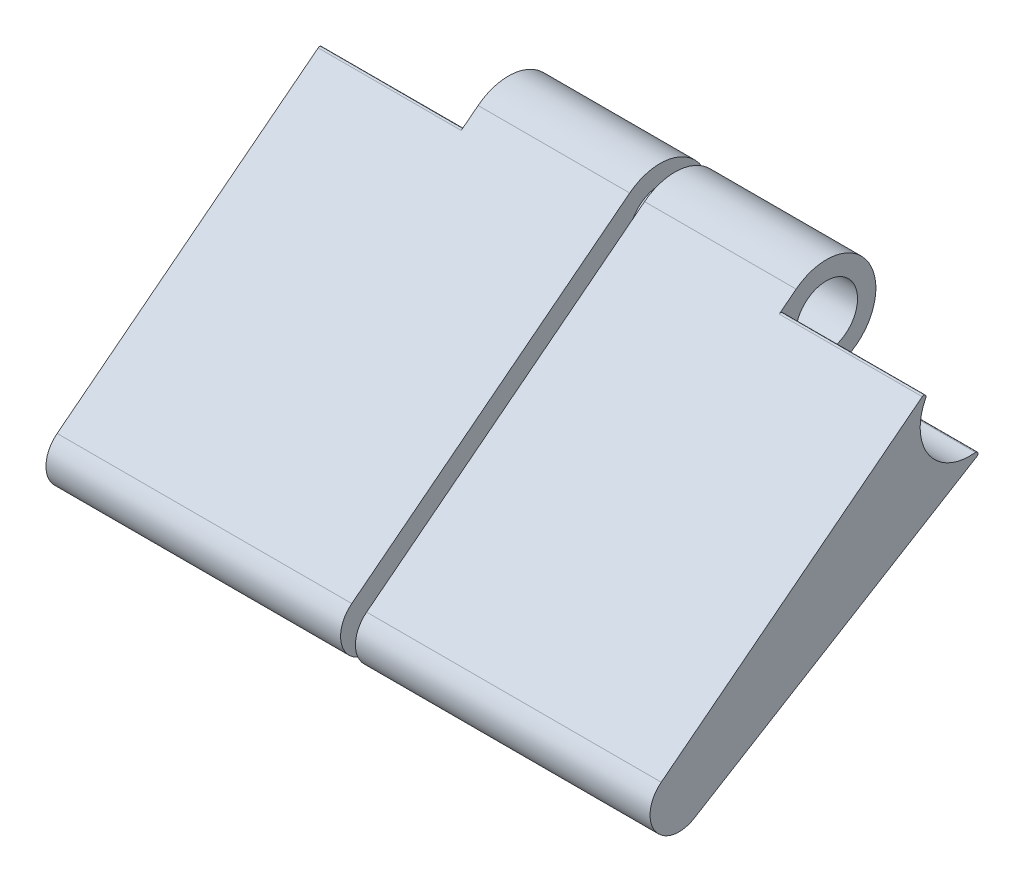
ISO-10303-21;
HEADER;
FILE_DESCRIPTION(('STEP AP214'),'2;1');
FILE_NAME('part.step','',(''),(''),'','','');
FILE_SCHEMA(('AUTOMOTIVE_DESIGN { 1 0 10303 214 1 1 1 1 }'));
ENDSEC;
DATA;
#1=APPLICATION_CONTEXT('core data for automotive mechanical design processes');
#2=APPLICATION_PROTOCOL_DEFINITION('international standard','automotive_design',2000,#1);
#3=PRODUCT_CONTEXT('',#1,'mechanical');
#4=PRODUCT('Part','Part','',(#3));
#5=PRODUCT_RELATED_PRODUCT_CATEGORY('part','',(#4));
#6=PRODUCT_DEFINITION_FORMATION('','',#4);
#7=PRODUCT_DEFINITION_CONTEXT('part definition',#1,'design');
#8=PRODUCT_DEFINITION('design','',#6,#7);
#9=PRODUCT_DEFINITION_SHAPE('','',#8);
#10=(LENGTH_UNIT() NAMED_UNIT(*) SI_UNIT(.MILLI.,.METRE.));
#11=(NAMED_UNIT(*) PLANE_ANGLE_UNIT() SI_UNIT($,.RADIAN.));
#12=(NAMED_UNIT(*) SI_UNIT($,.STERADIAN.) SOLID_ANGLE_UNIT());
#13=UNCERTAINTY_MEASURE_WITH_UNIT(LENGTH_MEASURE(1.E-05),#10,'distance_accuracy_value','');
#14=(GEOMETRIC_REPRESENTATION_CONTEXT(3) GLOBAL_UNCERTAINTY_ASSIGNED_CONTEXT((#13)) GLOBAL_UNIT_ASSIGNED_CONTEXT((#10,
#11,#12)) REPRESENTATION_CONTEXT('',''));
#15=CARTESIAN_POINT('',(0.,0.,0.));
#16=DIRECTION('',(0.,0.,1.));
#17=DIRECTION('',(1.,0.,0.));
#18=AXIS2_PLACEMENT_3D('',#15,#16,#17);
#19=CARTESIAN_POINT('',(44.25,0.,0.));
#20=DIRECTION('',(-1.,0.,0.));
#21=DIRECTION('',(0.,0.,-1.));
#22=AXIS2_PLACEMENT_3D('',#19,#20,#21);
#23=PLANE('',#22);
#24=CARTESIAN_POINT('',(44.25,-39.375,83.));
#25=DIRECTION('',(1.,0.,0.));
#26=DIRECTION('',(0.,0.,-1.));
#27=AXIS2_PLACEMENT_3D('',#24,#25,#26);
#28=CIRCLE('',#27,2.125);
#29=CARTESIAN_POINT('',(44.25,-38.3905832731811,84.883228267619));
#30=VERTEX_POINT('',#29);
#31=CARTESIAN_POINT('',(44.25,-41.4848766818374,82.7469280982826));
#32=VERTEX_POINT('',#31);
#33=EDGE_CURVE('E141',#30,#32,#28,.T.);
#34=ORIENTED_EDGE('',*,*,#33,.T.);
#35=CARTESIAN_POINT('',(44.25,-41.5841649962768,82.7350188323195));
#36=DIRECTION('',(1.,0.,0.));
#37=DIRECTION('',(0.,0.,-1.));
#38=AXIS2_PLACEMENT_3D('',#35,#36,#37);
#39=CIRCLE('',#38,0.0999999999999971);
#40=CARTESIAN_POINT('',(44.25,-41.6695937765194,82.68303880244));
#41=VERTEX_POINT('',#40);
#42=EDGE_CURVE('E191',#32,#41,#39,.F.);
#43=ORIENTED_EDGE('',*,*,#42,.T.);
#44=DIRECTION('',(0.,0.519800298794591,-0.854287802425537));
#45=VECTOR('',#44,1.);
#46=CARTESIAN_POINT('',(44.25,6.30536378724332,3.8365641781516));
#47=LINE('',#46,#45);
#48=CARTESIAN_POINT('',(44.25,-49.0728597530319,94.8502496265068));
#49=VERTEX_POINT('',#48);
#50=EDGE_CURVE('E158',#49,#41,#47,.T.);
#51=ORIENTED_EDGE('',*,*,#50,.F.);
#52=CARTESIAN_POINT('',(44.25,-48.005,95.5));
#53=DIRECTION('',(1.,0.,0.));
#54=DIRECTION('',(0.,0.,-1.));
#55=AXIS2_PLACEMENT_3D('',#52,#53,#54);
#56=CIRCLE('',#55,1.25);
#57=CARTESIAN_POINT('',(44.25,-47.0189604638566,96.2682616957535));
#58=VERTEX_POINT('',#57);
#59=EDGE_CURVE('E167',#58,#49,#56,.T.);
#60=ORIENTED_EDGE('',*,*,#59,.F.);
#61=DIRECTION('',(0.,0.614609356602763,-0.788831628914776));
#62=VECTOR('',#61,1.);
#63=CARTESIAN_POINT('',(44.25,17.4152971400888,13.568934330183));
#64=LINE('',#63,#62);
#65=CARTESIAN_POINT('',(44.25,-38.2653746172628,85.0333117099908));
#66=VERTEX_POINT('',#65);
#67=EDGE_CURVE('E52',#58,#66,#64,.T.);
#68=ORIENTED_EDGE('',*,*,#67,.T.);
#69=CARTESIAN_POINT('',(44.25,-38.3442577801543,84.9718507743305));
#70=DIRECTION('',(1.,0.,0.));
#71=DIRECTION('',(0.,0.,-1.));
#72=AXIS2_PLACEMENT_3D('',#69,#70,#71);
#73=CIRCLE('',#72,0.100000000000003);
#74=EDGE_CURVE('E129',#30,#66,#73,.T.);
#75=ORIENTED_EDGE('',*,*,#74,.F.);
#76=EDGE_LOOP('',(#34,#43,#51,#60,#68,#75));
#77=FACE_BOUND('',#76,.T.);
#78=ADVANCED_FACE('F48',(#77),#23,.T.);
#79=CARTESIAN_POINT('',(50.4062351896748,-39.375,83.));
#80=DIRECTION('',(-1.,0.,0.));
#81=DIRECTION('',(0.,0.,-1.));
#82=AXIS2_PLACEMENT_3D('',#79,#80,#81);
#83=CYLINDRICAL_SURFACE('',#82,2.125);
#84=DIRECTION('',(-1.,0.,0.));
#85=VECTOR('',#84,1.);
#86=CARTESIAN_POINT('',(50.4062351896748,-41.4848766818374,82.7469280982826));
#87=LINE('',#86,#85);
#88=CARTESIAN_POINT('',(50.4062351896748,-41.4848766818374,82.7469280982826));
#89=VERTEX_POINT('',#88);
#90=EDGE_CURVE('E183',#89,#32,#87,.T.);
#91=ORIENTED_EDGE('',*,*,#90,.T.);
#92=ORIENTED_EDGE('',*,*,#33,.F.);
#93=DIRECTION('',(-1.,0.,0.));
#94=VECTOR('',#93,1.);
#95=CARTESIAN_POINT('',(50.4062351896748,-38.3905832731811,84.883228267619));
#96=LINE('',#95,#94);
#97=CARTESIAN_POINT('',(50.4062351896748,-38.3905832731811,84.883228267619));
#98=VERTEX_POINT('',#97);
#99=EDGE_CURVE('E132',#98,#30,#96,.T.);
#100=ORIENTED_EDGE('',*,*,#99,.F.);
#101=CARTESIAN_POINT('',(50.4062351896748,-39.375,83.));
#102=DIRECTION('',(1.,0.,0.));
#103=DIRECTION('',(0.,0.,-1.));
#104=AXIS2_PLACEMENT_3D('',#101,#102,#103);
#105=CIRCLE('',#104,2.125);
#106=EDGE_CURVE('E121',#98,#89,#105,.T.);
#107=ORIENTED_EDGE('',*,*,#106,.T.);
#108=EDGE_LOOP('',(#91,#92,#100,#107));
#109=FACE_BOUND('',#108,.T.);
#110=ADVANCED_FACE('F186',(#109),#83,.F.);
#111=CARTESIAN_POINT('',(76.833645803728,-39.375,83.));
#112=DIRECTION('',(-1.,0.,0.));
#113=DIRECTION('',(0.,0.,-1.));
#114=AXIS2_PLACEMENT_3D('',#111,#112,#113);
#115=CYLINDRICAL_SURFACE('',#114,2.125);
#116=DIRECTION('',(-1.,0.,0.));
#117=VECTOR('',#116,1.);
#118=CARTESIAN_POINT('',(76.833645803728,-37.6987327885561,84.3060448827809));
#119=LINE('',#118,#117);
#120=CARTESIAN_POINT('',(56.9304890189363,-37.6987327885561,84.3060448827809));
#121=VERTEX_POINT('',#120);
#122=CARTESIAN_POINT('',(50.4062351896748,-37.6987327885561,84.3060448827809));
#123=VERTEX_POINT('',#122);
#124=EDGE_CURVE('E136',#121,#123,#119,.T.);
#125=ORIENTED_EDGE('',*,*,#124,.F.);
#126=CARTESIAN_POINT('',(56.9304890189363,-39.375,83.));
#127=DIRECTION('',(-1.,0.,0.));
#128=DIRECTION('',(0.,0.,1.));
#129=AXIS2_PLACEMENT_3D('',#126,#127,#128);
#130=CIRCLE('',#129,2.125);
#131=CARTESIAN_POINT('',(56.9304890189363,-41.1903615801543,81.8954243650615));
#132=VERTEX_POINT('',#131);
#133=EDGE_CURVE('E152',#132,#121,#130,.F.);
#134=ORIENTED_EDGE('',*,*,#133,.F.);
#135=DIRECTION('',(-1.,0.,0.));
#136=VECTOR('',#135,1.);
#137=CARTESIAN_POINT('',(76.833645803728,-41.1903615801543,81.8954243650615));
#138=LINE('',#137,#136);
#139=CARTESIAN_POINT('',(50.4062351896748,-41.1903615801543,81.8954243650615));
#140=VERTEX_POINT('',#139);
#141=EDGE_CURVE('E169',#132,#140,#138,.T.);
#142=ORIENTED_EDGE('',*,*,#141,.T.);
#143=EDGE_CURVE('E149',#140,#123,#105,.T.);
#144=ORIENTED_EDGE('',*,*,#143,.T.);
#145=EDGE_LOOP('',(#125,#134,#142,#144));
#146=FACE_BOUND('',#145,.T.);
#147=ADVANCED_FACE('F176',(#146),#115,.T.);
#148=CARTESIAN_POINT('',(76.833645803728,-39.375,83.));
#149=DIRECTION('',(-1.,0.,0.));
#150=DIRECTION('',(0.,0.,-1.));
#151=AXIS2_PLACEMENT_3D('',#148,#149,#150);
#152=CYLINDRICAL_SURFACE('',#151,1.33513379726097);
#153=CARTESIAN_POINT('',(56.9304890189363,-39.375,83.));
#154=DIRECTION('',(-1.,0.,0.));
#155=DIRECTION('',(0.,0.,1.));
#156=AXIS2_PLACEMENT_3D('',#153,#154,#155);
#157=CIRCLE('',#156,1.33513379726097);
#158=CARTESIAN_POINT('',(56.9304890189363,-39.375,84.335133797261));
#159=VERTEX_POINT('',#158);
#160=EDGE_CURVE('E148',#159,#159,#157,.T.);
#161=ORIENTED_EDGE('',*,*,#160,.F.);
#162=EDGE_LOOP('',(#161));
#163=FACE_BOUND('',#162,.T.);
#164=CARTESIAN_POINT('',(50.4062351896748,-39.375,83.));
#165=DIRECTION('',(1.,0.,0.));
#166=DIRECTION('',(0.,0.,-1.));
#167=AXIS2_PLACEMENT_3D('',#164,#165,#166);
#168=CIRCLE('',#167,1.33513379726097);
#169=CARTESIAN_POINT('',(50.4062351896748,-39.375,81.664866202739));
#170=VERTEX_POINT('',#169);
#171=EDGE_CURVE('E137',#170,#170,#168,.T.);
#172=ORIENTED_EDGE('',*,*,#171,.F.);
#173=EDGE_LOOP('',(#172));
#174=FACE_BOUND('',#173,.T.);
#175=ADVANCED_FACE('F217',(#163,#174),#152,.F.);
#176=CARTESIAN_POINT('',(76.833645803728,17.4152971400888,13.568934330183));
#177=DIRECTION('',(0.,-0.788831628914776,-0.614609356602763));
#178=DIRECTION('',(0.,0.614609356602763,-0.788831628914776));
#179=AXIS2_PLACEMENT_3D('',#176,#177,#178);
#180=PLANE('',#179);
#181=ORIENTED_EDGE('',*,*,#67,.F.);
#182=DIRECTION('',(-1.,0.,0.));
#183=VECTOR('',#182,1.);
#184=CARTESIAN_POINT('',(76.833645803728,-47.0189604638566,96.2682616957535));
#185=LINE('',#184,#183);
#186=CARTESIAN_POINT('',(56.9304890189363,-47.0189604638566,96.2682616957535));
#187=VERTEX_POINT('',#186);
#188=EDGE_CURVE('E58',#187,#58,#185,.T.);
#189=ORIENTED_EDGE('',*,*,#188,.F.);
#190=DIRECTION('',(0.,0.614609356602763,-0.788831628914776));
#191=VECTOR('',#190,1.);
#192=CARTESIAN_POINT('',(56.9304890189363,17.4152971400888,13.568934330183));
#193=LINE('',#192,#191);
#194=EDGE_CURVE('E74',#187,#121,#193,.T.);
#195=ORIENTED_EDGE('',*,*,#194,.T.);
#196=ORIENTED_EDGE('',*,*,#124,.T.);
#197=DIRECTION('',(0.,-0.614609356602763,0.788831628914776));
#198=VECTOR('',#197,1.);
#199=CARTESIAN_POINT('',(50.4062351896748,17.4152971400888,13.568934330183));
#200=LINE('',#199,#198);
#201=CARTESIAN_POINT('',(50.4062351896748,-38.2653746172628,85.0333117099908));
#202=VERTEX_POINT('',#201);
#203=EDGE_CURVE('E118',#123,#202,#200,.T.);
#204=ORIENTED_EDGE('',*,*,#203,.T.);
#205=DIRECTION('',(-1.,0.,0.));
#206=VECTOR('',#205,1.);
#207=CARTESIAN_POINT('',(50.4062351896748,-38.2653746172628,85.0333117099908));
#208=LINE('',#207,#206);
#209=EDGE_CURVE('E123',#202,#66,#208,.T.);
#210=ORIENTED_EDGE('',*,*,#209,.T.);
#211=EDGE_LOOP('',(#181,#189,#195,#196,#204,#210));
#212=FACE_BOUND('',#211,.T.);
#213=ADVANCED_FACE('F134',(#212),#180,.F.);
#214=CARTESIAN_POINT('',(76.833645803728,-48.005,95.5));
#215=DIRECTION('',(-1.,0.,0.));
#216=DIRECTION('',(0.,0.,-1.));
#217=AXIS2_PLACEMENT_3D('',#214,#215,#216);
#218=CYLINDRICAL_SURFACE('',#217,1.25);
#219=ORIENTED_EDGE('',*,*,#188,.T.);
#220=ORIENTED_EDGE('',*,*,#59,.T.);
#221=DIRECTION('',(-1.,0.,0.));
#222=VECTOR('',#221,1.);
#223=CARTESIAN_POINT('',(76.833645803728,-49.0728597530319,94.8502496265068));
#224=LINE('',#223,#222);
#225=CARTESIAN_POINT('',(56.9304890189363,-49.0728597530319,94.8502496265068));
#226=VERTEX_POINT('',#225);
#227=EDGE_CURVE('E12',#226,#49,#224,.T.);
#228=ORIENTED_EDGE('',*,*,#227,.F.);
#229=CARTESIAN_POINT('',(56.9304890189363,-48.005,95.5));
#230=DIRECTION('',(-1.,0.,0.));
#231=DIRECTION('',(0.,0.,1.));
#232=AXIS2_PLACEMENT_3D('',#229,#230,#231);
#233=CIRCLE('',#232,1.25);
#234=EDGE_CURVE('E210',#187,#226,#233,.F.);
#235=ORIENTED_EDGE('',*,*,#234,.F.);
#236=EDGE_LOOP('',(#219,#220,#228,#235));
#237=FACE_BOUND('',#236,.T.);
#238=ADVANCED_FACE('F208',(#237),#218,.T.);
#239=CARTESIAN_POINT('',(76.833645803728,6.30536378724332,3.8365641781516));
#240=DIRECTION('',(0.,-0.854287802425538,-0.519800298794591));
#241=DIRECTION('',(0.,0.519800298794591,-0.854287802425538));
#242=AXIS2_PLACEMENT_3D('',#239,#240,#241);
#243=PLANE('',#242);
#244=DIRECTION('',(-1.,0.,0.));
#245=VECTOR('',#244,1.);
#246=CARTESIAN_POINT('',(50.4062351896748,-41.6695937765194,82.68303880244));
#247=LINE('',#246,#245);
#248=CARTESIAN_POINT('',(50.4062351896748,-41.6695937765194,82.68303880244));
#249=VERTEX_POINT('',#248);
#250=EDGE_CURVE('E124',#249,#41,#247,.T.);
#251=ORIENTED_EDGE('',*,*,#250,.F.);
#252=DIRECTION('',(0.,-0.519800298794591,0.854287802425538));
#253=VECTOR('',#252,1.);
#254=CARTESIAN_POINT('',(50.4062351896748,6.30536378724332,3.8365641781516));
#255=LINE('',#254,#253);
#256=EDGE_CURVE('E138',#140,#249,#255,.T.);
#257=ORIENTED_EDGE('',*,*,#256,.F.);
#258=ORIENTED_EDGE('',*,*,#141,.F.);
#259=DIRECTION('',(0.,0.519800298794591,-0.854287802425538));
#260=VECTOR('',#259,1.);
#261=CARTESIAN_POINT('',(56.9304890189363,6.30536378724332,3.83656417815159));
#262=LINE('',#261,#260);
#263=EDGE_CURVE('E161',#226,#132,#262,.T.);
#264=ORIENTED_EDGE('',*,*,#263,.F.);
#265=ORIENTED_EDGE('',*,*,#227,.T.);
#266=ORIENTED_EDGE('',*,*,#50,.T.);
#267=EDGE_LOOP('',(#251,#257,#258,#264,#265,#266));
#268=FACE_BOUND('',#267,.T.);
#269=ADVANCED_FACE('F50',(#268),#243,.T.);
#270=CARTESIAN_POINT('',(56.9304890189363,-47.,0.));
#271=DIRECTION('',(1.,0.,0.));
#272=DIRECTION('',(0.,0.,1.));
#273=AXIS2_PLACEMENT_3D('',#270,#271,#272);
#274=PLANE('',#273);
#275=ORIENTED_EDGE('',*,*,#263,.T.);
#276=ORIENTED_EDGE('',*,*,#133,.T.);
#277=ORIENTED_EDGE('',*,*,#194,.F.);
#278=ORIENTED_EDGE('',*,*,#234,.T.);
#279=EDGE_LOOP('',(#275,#276,#277,#278));
#280=FACE_BOUND('',#279,.T.);
#281=ORIENTED_EDGE('',*,*,#160,.T.);
#282=EDGE_LOOP('',(#281));
#283=FACE_BOUND('',#282,.T.);
#284=ADVANCED_FACE('F212',(#280,#283),#274,.T.);
#285=CARTESIAN_POINT('',(50.4062351896748,-39.375,83.));
#286=DIRECTION('',(-1.,0.,0.));
#287=DIRECTION('',(0.,0.,-1.));
#288=AXIS2_PLACEMENT_3D('',#285,#286,#287);
#289=PLANE('',#288);
#290=ORIENTED_EDGE('',*,*,#171,.T.);
#291=EDGE_LOOP('',(#290));
#292=FACE_BOUND('',#291,.T.);
#293=ORIENTED_EDGE('',*,*,#106,.F.);
#294=CARTESIAN_POINT('',(50.4062351896748,-38.3442577801543,84.9718507743305));
#295=DIRECTION('',(1.,0.,0.));
#296=DIRECTION('',(0.,0.,-1.));
#297=AXIS2_PLACEMENT_3D('',#294,#295,#296);
#298=CIRCLE('',#297,0.100000000000003);
#299=EDGE_CURVE('E66',#98,#202,#298,.T.);
#300=ORIENTED_EDGE('',*,*,#299,.T.);
#301=ORIENTED_EDGE('',*,*,#203,.F.);
#302=ORIENTED_EDGE('',*,*,#143,.F.);
#303=ORIENTED_EDGE('',*,*,#256,.T.);
#304=CARTESIAN_POINT('',(50.4062351896748,-41.5841649962768,82.7350188323195));
#305=DIRECTION('',(1.,0.,0.));
#306=DIRECTION('',(0.,0.,-1.));
#307=AXIS2_PLACEMENT_3D('',#304,#305,#306);
#308=CIRCLE('',#307,0.0999999999999971);
#309=EDGE_CURVE('E180',#89,#249,#308,.F.);
#310=ORIENTED_EDGE('',*,*,#309,.F.);
#311=EDGE_LOOP('',(#293,#300,#301,#302,#303,#310));
#312=FACE_BOUND('',#311,.T.);
#313=ADVANCED_FACE('F115',(#292,#312),#289,.T.);
#314=CARTESIAN_POINT('',(50.4062351896748,-41.5841649962768,82.7350188323195));
#315=DIRECTION('',(-1.,0.,0.));
#316=DIRECTION('',(0.,0.,-1.));
#317=AXIS2_PLACEMENT_3D('',#314,#315,#316);
#318=CYLINDRICAL_SURFACE('',#317,0.0999999999999971);
#319=ORIENTED_EDGE('',*,*,#42,.F.);
#320=ORIENTED_EDGE('',*,*,#90,.F.);
#321=ORIENTED_EDGE('',*,*,#309,.T.);
#322=ORIENTED_EDGE('',*,*,#250,.T.);
#323=EDGE_LOOP('',(#319,#320,#321,#322));
#324=FACE_BOUND('',#323,.T.);
#325=ADVANCED_FACE('F189',(#324),#318,.T.);
#326=CARTESIAN_POINT('',(50.4062351896748,-38.3442577801543,84.9718507743305));
#327=DIRECTION('',(-1.,0.,0.));
#328=DIRECTION('',(0.,0.,-1.));
#329=AXIS2_PLACEMENT_3D('',#326,#327,#328);
#330=CYLINDRICAL_SURFACE('',#329,0.100000000000003);
#331=ORIENTED_EDGE('',*,*,#99,.T.);
#332=ORIENTED_EDGE('',*,*,#74,.T.);
#333=ORIENTED_EDGE('',*,*,#209,.F.);
#334=ORIENTED_EDGE('',*,*,#299,.F.);
#335=EDGE_LOOP('',(#331,#332,#333,#334));
#336=FACE_BOUND('',#335,.T.);
#337=ADVANCED_FACE('F127',(#336),#330,.T.);
#338=CLOSED_SHELL('',(#78,#110,#147,#175,#213,#238,#269,#284,#313,#325,#337));
#339=MANIFOLD_SOLID_BREP('B2',#338);
#340=CARTESIAN_POINT('',(70.25,0.,0.));
#341=DIRECTION('',(1.,0.,0.));
#342=DIRECTION('',(0.,0.,-1.));
#343=AXIS2_PLACEMENT_3D('',#340,#341,#342);
#344=PLANE('',#343);
#345=CARTESIAN_POINT('',(70.25,-39.375,83.));
#346=DIRECTION('',(1.,0.,0.));
#347=DIRECTION('',(0.,0.,-1.));
#348=AXIS2_PLACEMENT_3D('',#345,#346,#347);
#349=CIRCLE('',#348,2.125);
#350=CARTESIAN_POINT('',(70.25,-38.3905832731811,84.883228267619));
#351=VERTEX_POINT('',#350);
#352=CARTESIAN_POINT('',(70.25,-41.4848766818374,82.7469280982826));
#353=VERTEX_POINT('',#352);
#354=EDGE_CURVE('E464',#351,#353,#349,.T.);
#355=ORIENTED_EDGE('',*,*,#354,.F.);
#356=CARTESIAN_POINT('',(70.25,-38.3442577801543,84.9718507743305));
#357=DIRECTION('',(1.,0.,0.));
#358=DIRECTION('',(0.,0.,-1.));
#359=AXIS2_PLACEMENT_3D('',#356,#357,#358);
#360=CIRCLE('',#359,0.100000000000003);
#361=CARTESIAN_POINT('',(70.25,-38.2653746172628,85.0333117099908));
#362=VERTEX_POINT('',#361);
#363=EDGE_CURVE('E454',#351,#362,#360,.T.);
#364=ORIENTED_EDGE('',*,*,#363,.T.);
#365=DIRECTION('',(0.,0.614609356602763,-0.788831628914776));
#366=VECTOR('',#365,1.);
#367=CARTESIAN_POINT('',(70.25,17.4152971400888,13.568934330183));
#368=LINE('',#367,#366);
#369=CARTESIAN_POINT('',(70.25,-47.0189604638566,96.2682616957535));
#370=VERTEX_POINT('',#369);
#371=EDGE_CURVE('E353',#370,#362,#368,.T.);
#372=ORIENTED_EDGE('',*,*,#371,.F.);
#373=CARTESIAN_POINT('',(70.25,-48.005,95.5));
#374=DIRECTION('',(1.,0.,0.));
#375=DIRECTION('',(0.,0.,-1.));
#376=AXIS2_PLACEMENT_3D('',#373,#374,#375);
#377=CIRCLE('',#376,1.25);
#378=CARTESIAN_POINT('',(70.25,-49.0728597530319,94.8502496265068));
#379=VERTEX_POINT('',#378);
#380=EDGE_CURVE('E483',#370,#379,#377,.T.);
#381=ORIENTED_EDGE('',*,*,#380,.T.);
#382=DIRECTION('',(0.,0.519800298794591,-0.854287802425537));
#383=VECTOR('',#382,1.);
#384=CARTESIAN_POINT('',(70.25,6.30536378724332,3.8365641781516));
#385=LINE('',#384,#383);
#386=CARTESIAN_POINT('',(70.25,-41.6695937765194,82.68303880244));
#387=VERTEX_POINT('',#386);
#388=EDGE_CURVE('E475',#379,#387,#385,.T.);
#389=ORIENTED_EDGE('',*,*,#388,.T.);
#390=CARTESIAN_POINT('',(70.25,-41.5841649962768,82.7350188323195));
#391=DIRECTION('',(1.,0.,0.));
#392=DIRECTION('',(0.,0.,-1.));
#393=AXIS2_PLACEMENT_3D('',#390,#391,#392);
#394=CIRCLE('',#393,0.0999999999999971);
#395=EDGE_CURVE('E437',#353,#387,#394,.F.);
#396=ORIENTED_EDGE('',*,*,#395,.F.);
#397=EDGE_LOOP('',(#355,#364,#372,#381,#389,#396));
#398=FACE_BOUND('',#397,.T.);
#399=ADVANCED_FACE('F349',(#398),#344,.T.);
#400=CARTESIAN_POINT('',(64.0937648103252,-39.375,83.));
#401=DIRECTION('',(1.,0.,0.));
#402=DIRECTION('',(0.,0.,-1.));
#403=AXIS2_PLACEMENT_3D('',#400,#401,#402);
#404=CYLINDRICAL_SURFACE('',#403,2.125);
#405=DIRECTION('',(1.,0.,0.));
#406=VECTOR('',#405,1.);
#407=CARTESIAN_POINT('',(64.0937648103252,-41.4848766818374,82.7469280982826));
#408=LINE('',#407,#406);
#409=CARTESIAN_POINT('',(64.0937648103252,-41.4848766818374,82.7469280982826));
#410=VERTEX_POINT('',#409);
#411=EDGE_CURVE('E445',#410,#353,#408,.T.);
#412=ORIENTED_EDGE('',*,*,#411,.F.);
#413=CARTESIAN_POINT('',(64.0937648103252,-39.375,83.));
#414=DIRECTION('',(1.,0.,0.));
#415=DIRECTION('',(0.,0.,-1.));
#416=AXIS2_PLACEMENT_3D('',#413,#414,#415);
#417=CIRCLE('',#416,2.125);
#418=CARTESIAN_POINT('',(64.0937648103252,-38.3905832731811,84.883228267619));
#419=VERTEX_POINT('',#418);
#420=EDGE_CURVE('E465',#419,#410,#417,.T.);
#421=ORIENTED_EDGE('',*,*,#420,.F.);
#422=DIRECTION('',(1.,0.,0.));
#423=VECTOR('',#422,1.);
#424=CARTESIAN_POINT('',(64.0937648103252,-38.3905832731811,84.883228267619));
#425=LINE('',#424,#423);
#426=EDGE_CURVE('E430',#419,#351,#425,.T.);
#427=ORIENTED_EDGE('',*,*,#426,.T.);
#428=ORIENTED_EDGE('',*,*,#354,.T.);
#429=EDGE_LOOP('',(#412,#421,#427,#428));
#430=FACE_BOUND('',#429,.T.);
#431=ADVANCED_FACE('F520',(#430),#404,.F.);
#432=CARTESIAN_POINT('',(37.666354196272,-39.375,83.));
#433=DIRECTION('',(1.,0.,0.));
#434=DIRECTION('',(0.,0.,-1.));
#435=AXIS2_PLACEMENT_3D('',#432,#433,#434);
#436=CYLINDRICAL_SURFACE('',#435,2.125);
#437=DIRECTION('',(1.,0.,0.));
#438=VECTOR('',#437,1.);
#439=CARTESIAN_POINT('',(37.666354196272,-37.6987327885561,84.3060448827809));
#440=LINE('',#439,#438);
#441=CARTESIAN_POINT('',(57.5695109810637,-37.6987327885561,84.3060448827809));
#442=VERTEX_POINT('',#441);
#443=CARTESIAN_POINT('',(64.0937648103252,-37.6987327885561,84.3060448827809));
#444=VERTEX_POINT('',#443);
#445=EDGE_CURVE('E488',#442,#444,#440,.T.);
#446=ORIENTED_EDGE('',*,*,#445,.T.);
#447=CARTESIAN_POINT('',(64.0937648103252,-41.1903615801543,81.8954243650615));
#448=VERTEX_POINT('',#447);
#449=EDGE_CURVE('E417',#448,#444,#417,.T.);
#450=ORIENTED_EDGE('',*,*,#449,.F.);
#451=DIRECTION('',(1.,0.,0.));
#452=VECTOR('',#451,1.);
#453=CARTESIAN_POINT('',(37.666354196272,-41.1903615801543,81.8954243650615));
#454=LINE('',#453,#452);
#455=CARTESIAN_POINT('',(57.5695109810637,-41.1903615801543,81.8954243650615));
#456=VERTEX_POINT('',#455);
#457=EDGE_CURVE('E485',#456,#448,#454,.T.);
#458=ORIENTED_EDGE('',*,*,#457,.F.);
#459=CARTESIAN_POINT('',(57.5695109810637,-39.375,83.));
#460=DIRECTION('',(-1.,0.,0.));
#461=DIRECTION('',(0.,0.,1.));
#462=AXIS2_PLACEMENT_3D('',#459,#460,#461);
#463=CIRCLE('',#462,2.125);
#464=EDGE_CURVE('E470',#456,#442,#463,.F.);
#465=ORIENTED_EDGE('',*,*,#464,.T.);
#466=EDGE_LOOP('',(#446,#450,#458,#465));
#467=FACE_BOUND('',#466,.T.);
#468=ADVANCED_FACE('F496',(#467),#436,.T.);
#469=CARTESIAN_POINT('',(37.666354196272,-39.375,83.));
#470=DIRECTION('',(1.,0.,0.));
#471=DIRECTION('',(0.,0.,-1.));
#472=AXIS2_PLACEMENT_3D('',#469,#470,#471);
#473=CYLINDRICAL_SURFACE('',#472,1.33513379726097);
#474=CARTESIAN_POINT('',(57.5695109810637,-39.375,83.));
#475=DIRECTION('',(-1.,0.,0.));
#476=DIRECTION('',(0.,0.,1.));
#477=AXIS2_PLACEMENT_3D('',#474,#475,#476);
#478=CIRCLE('',#477,1.33513379726097);
#479=CARTESIAN_POINT('',(57.5695109810637,-39.375,84.335133797261));
#480=VERTEX_POINT('',#479);
#481=EDGE_CURVE('E467',#480,#480,#478,.T.);
#482=ORIENTED_EDGE('',*,*,#481,.T.);
#483=EDGE_LOOP('',(#482));
#484=FACE_BOUND('',#483,.T.);
#485=CARTESIAN_POINT('',(64.0937648103252,-39.375,83.));
#486=DIRECTION('',(1.,0.,0.));
#487=DIRECTION('',(0.,0.,-1.));
#488=AXIS2_PLACEMENT_3D('',#485,#486,#487);
#489=CIRCLE('',#488,1.33513379726097);
#490=CARTESIAN_POINT('',(64.0937648103252,-39.375,81.664866202739));
#491=VERTEX_POINT('',#490);
#492=EDGE_CURVE('E421',#491,#491,#489,.T.);
#493=ORIENTED_EDGE('',*,*,#492,.T.);
#494=EDGE_LOOP('',(#493));
#495=FACE_BOUND('',#494,.T.);
#496=ADVANCED_FACE('F503',(#484,#495),#473,.F.);
#497=CARTESIAN_POINT('',(37.666354196272,17.4152971400888,13.568934330183));
#498=DIRECTION('',(0.,-0.788831628914776,-0.614609356602763));
#499=DIRECTION('',(0.,0.614609356602763,-0.788831628914776));
#500=AXIS2_PLACEMENT_3D('',#497,#498,#499);
#501=PLANE('',#500);
#502=ORIENTED_EDGE('',*,*,#371,.T.);
#503=DIRECTION('',(1.,0.,0.));
#504=VECTOR('',#503,1.);
#505=CARTESIAN_POINT('',(64.0937648103252,-38.2653746172628,85.0333117099908));
#506=LINE('',#505,#504);
#507=CARTESIAN_POINT('',(64.0937648103252,-38.2653746172628,85.0333117099908));
#508=VERTEX_POINT('',#507);
#509=EDGE_CURVE('E427',#508,#362,#506,.T.);
#510=ORIENTED_EDGE('',*,*,#509,.F.);
#511=DIRECTION('',(0.,-0.614609356602763,0.788831628914776));
#512=VECTOR('',#511,1.);
#513=CARTESIAN_POINT('',(64.0937648103252,17.4152971400888,13.568934330183));
#514=LINE('',#513,#512);
#515=EDGE_CURVE('E414',#444,#508,#514,.T.);
#516=ORIENTED_EDGE('',*,*,#515,.F.);
#517=ORIENTED_EDGE('',*,*,#445,.F.);
#518=DIRECTION('',(0.,0.614609356602763,-0.788831628914776));
#519=VECTOR('',#518,1.);
#520=CARTESIAN_POINT('',(57.5695109810637,17.4152971400888,13.568934330183));
#521=LINE('',#520,#519);
#522=CARTESIAN_POINT('',(57.5695109810637,-47.0189604638566,96.2682616957535));
#523=VERTEX_POINT('',#522);
#524=EDGE_CURVE('E375',#523,#442,#521,.T.);
#525=ORIENTED_EDGE('',*,*,#524,.F.);
#526=DIRECTION('',(1.,0.,0.));
#527=VECTOR('',#526,1.);
#528=CARTESIAN_POINT('',(37.666354196272,-47.0189604638566,96.2682616957535));
#529=LINE('',#528,#527);
#530=EDGE_CURVE('E359',#523,#370,#529,.T.);
#531=ORIENTED_EDGE('',*,*,#530,.T.);
#532=EDGE_LOOP('',(#502,#510,#516,#517,#525,#531));
#533=FACE_BOUND('',#532,.T.);
#534=ADVANCED_FACE('F434',(#533),#501,.F.);
#535=CARTESIAN_POINT('',(37.666354196272,-48.005,95.5));
#536=DIRECTION('',(1.,0.,0.));
#537=DIRECTION('',(0.,0.,-1.));
#538=AXIS2_PLACEMENT_3D('',#535,#536,#537);
#539=CYLINDRICAL_SURFACE('',#538,1.25);
#540=ORIENTED_EDGE('',*,*,#530,.F.);
#541=CARTESIAN_POINT('',(57.5695109810637,-48.005,95.5));
#542=DIRECTION('',(-1.,0.,0.));
#543=DIRECTION('',(0.,0.,1.));
#544=AXIS2_PLACEMENT_3D('',#541,#542,#543);
#545=CIRCLE('',#544,1.25);
#546=CARTESIAN_POINT('',(57.5695109810637,-49.0728597530319,94.8502496265068));
#547=VERTEX_POINT('',#546);
#548=EDGE_CURVE('E498',#523,#547,#545,.F.);
#549=ORIENTED_EDGE('',*,*,#548,.T.);
#550=DIRECTION('',(1.,0.,0.));
#551=VECTOR('',#550,1.);
#552=CARTESIAN_POINT('',(37.666354196272,-49.0728597530319,94.8502496265068));
#553=LINE('',#552,#551);
#554=EDGE_CURVE('E46',#547,#379,#553,.T.);
#555=ORIENTED_EDGE('',*,*,#554,.T.);
#556=ORIENTED_EDGE('',*,*,#380,.F.);
#557=EDGE_LOOP('',(#540,#549,#555,#556));
#558=FACE_BOUND('',#557,.T.);
#559=ADVANCED_FACE('F516',(#558),#539,.T.);
#560=CARTESIAN_POINT('',(37.666354196272,6.30536378724332,3.8365641781516));
#561=DIRECTION('',(0.,-0.854287802425538,-0.519800298794591));
#562=DIRECTION('',(0.,0.519800298794591,-0.854287802425538));
#563=AXIS2_PLACEMENT_3D('',#560,#561,#562);
#564=PLANE('',#563);
#565=DIRECTION('',(1.,0.,0.));
#566=VECTOR('',#565,1.);
#567=CARTESIAN_POINT('',(64.0937648103252,-41.6695937765194,82.68303880244));
#568=LINE('',#567,#566);
#569=CARTESIAN_POINT('',(64.0937648103252,-41.6695937765194,82.68303880244));
#570=VERTEX_POINT('',#569);
#571=EDGE_CURVE('E432',#570,#387,#568,.T.);
#572=ORIENTED_EDGE('',*,*,#571,.T.);
#573=ORIENTED_EDGE('',*,*,#388,.F.);
#574=ORIENTED_EDGE('',*,*,#554,.F.);
#575=DIRECTION('',(0.,0.519800298794591,-0.854287802425538));
#576=VECTOR('',#575,1.);
#577=CARTESIAN_POINT('',(57.5695109810637,6.30536378724332,3.83656417815159));
#578=LINE('',#577,#576);
#579=EDGE_CURVE('E477',#547,#456,#578,.T.);
#580=ORIENTED_EDGE('',*,*,#579,.T.);
#581=ORIENTED_EDGE('',*,*,#457,.T.);
#582=DIRECTION('',(0.,-0.519800298794591,0.854287802425538));
#583=VECTOR('',#582,1.);
#584=CARTESIAN_POINT('',(64.0937648103252,6.30536378724332,3.8365641781516));
#585=LINE('',#584,#583);
#586=EDGE_CURVE('E422',#448,#570,#585,.T.);
#587=ORIENTED_EDGE('',*,*,#586,.T.);
#588=EDGE_LOOP('',(#572,#573,#574,#580,#581,#587));
#589=FACE_BOUND('',#588,.T.);
#590=ADVANCED_FACE('F351',(#589),#564,.T.);
#591=CARTESIAN_POINT('',(57.5695109810637,-47.,0.));
#592=DIRECTION('',(-1.,0.,0.));
#593=DIRECTION('',(0.,0.,1.));
#594=AXIS2_PLACEMENT_3D('',#591,#592,#593);
#595=PLANE('',#594);
#596=ORIENTED_EDGE('',*,*,#579,.F.);
#597=ORIENTED_EDGE('',*,*,#548,.F.);
#598=ORIENTED_EDGE('',*,*,#524,.T.);
#599=ORIENTED_EDGE('',*,*,#464,.F.);
#600=EDGE_LOOP('',(#596,#597,#598,#599));
#601=FACE_BOUND('',#600,.T.);
#602=ORIENTED_EDGE('',*,*,#481,.F.);
#603=EDGE_LOOP('',(#602));
#604=FACE_BOUND('',#603,.T.);
#605=ADVANCED_FACE('F506',(#601,#604),#595,.T.);
#606=CARTESIAN_POINT('',(64.0937648103252,-39.375,83.));
#607=DIRECTION('',(1.,0.,0.));
#608=DIRECTION('',(0.,0.,-1.));
#609=AXIS2_PLACEMENT_3D('',#606,#607,#608);
#610=PLANE('',#609);
#611=ORIENTED_EDGE('',*,*,#492,.F.);
#612=EDGE_LOOP('',(#611));
#613=FACE_BOUND('',#612,.T.);
#614=ORIENTED_EDGE('',*,*,#420,.T.);
#615=CARTESIAN_POINT('',(64.0937648103252,-41.5841649962768,82.7350188323195));
#616=DIRECTION('',(1.,0.,0.));
#617=DIRECTION('',(0.,0.,-1.));
#618=AXIS2_PLACEMENT_3D('',#615,#616,#617);
#619=CIRCLE('',#618,0.0999999999999971);
#620=EDGE_CURVE('E442',#410,#570,#619,.F.);
#621=ORIENTED_EDGE('',*,*,#620,.T.);
#622=ORIENTED_EDGE('',*,*,#586,.F.);
#623=ORIENTED_EDGE('',*,*,#449,.T.);
#624=ORIENTED_EDGE('',*,*,#515,.T.);
#625=CARTESIAN_POINT('',(64.0937648103252,-38.3442577801543,84.9718507743305));
#626=DIRECTION('',(1.,0.,0.));
#627=DIRECTION('',(0.,0.,-1.));
#628=AXIS2_PLACEMENT_3D('',#625,#626,#627);
#629=CIRCLE('',#628,0.100000000000003);
#630=EDGE_CURVE('E367',#419,#508,#629,.T.);
#631=ORIENTED_EDGE('',*,*,#630,.F.);
#632=EDGE_LOOP('',(#614,#621,#622,#623,#624,#631));
#633=FACE_BOUND('',#632,.T.);
#634=ADVANCED_FACE('F415',(#613,#633),#610,.T.);
#635=CARTESIAN_POINT('',(64.0937648103252,-41.5841649962768,82.7350188323195));
#636=DIRECTION('',(1.,0.,0.));
#637=DIRECTION('',(0.,0.,-1.));
#638=AXIS2_PLACEMENT_3D('',#635,#636,#637);
#639=CYLINDRICAL_SURFACE('',#638,0.0999999999999971);
#640=ORIENTED_EDGE('',*,*,#395,.T.);
#641=ORIENTED_EDGE('',*,*,#571,.F.);
#642=ORIENTED_EDGE('',*,*,#620,.F.);
#643=ORIENTED_EDGE('',*,*,#411,.T.);
#644=EDGE_LOOP('',(#640,#641,#642,#643));
#645=FACE_BOUND('',#644,.T.);
#646=ADVANCED_FACE('F513',(#645),#639,.T.);
#647=CARTESIAN_POINT('',(64.0937648103252,-38.3442577801543,84.9718507743305));
#648=DIRECTION('',(1.,0.,0.));
#649=DIRECTION('',(0.,0.,-1.));
#650=AXIS2_PLACEMENT_3D('',#647,#648,#649);
#651=CYLINDRICAL_SURFACE('',#650,0.100000000000003);
#652=ORIENTED_EDGE('',*,*,#426,.F.);
#653=ORIENTED_EDGE('',*,*,#630,.T.);
#654=ORIENTED_EDGE('',*,*,#509,.T.);
#655=ORIENTED_EDGE('',*,*,#363,.F.);
#656=EDGE_LOOP('',(#652,#653,#654,#655));
#657=FACE_BOUND('',#656,.T.);
#658=ADVANCED_FACE('F426',(#657),#651,.T.);
#659=CLOSED_SHELL('',(#399,#431,#468,#496,#534,#559,#590,#605,#634,#646,#658));
#660=MANIFOLD_SOLID_BREP('B6',#659);
#661=ADVANCED_BREP_SHAPE_REPRESENTATION('',(#18,#339,#660),#14);
#662=SHAPE_DEFINITION_REPRESENTATION(#9,#661);
ENDSEC;
END-ISO-10303-21;
